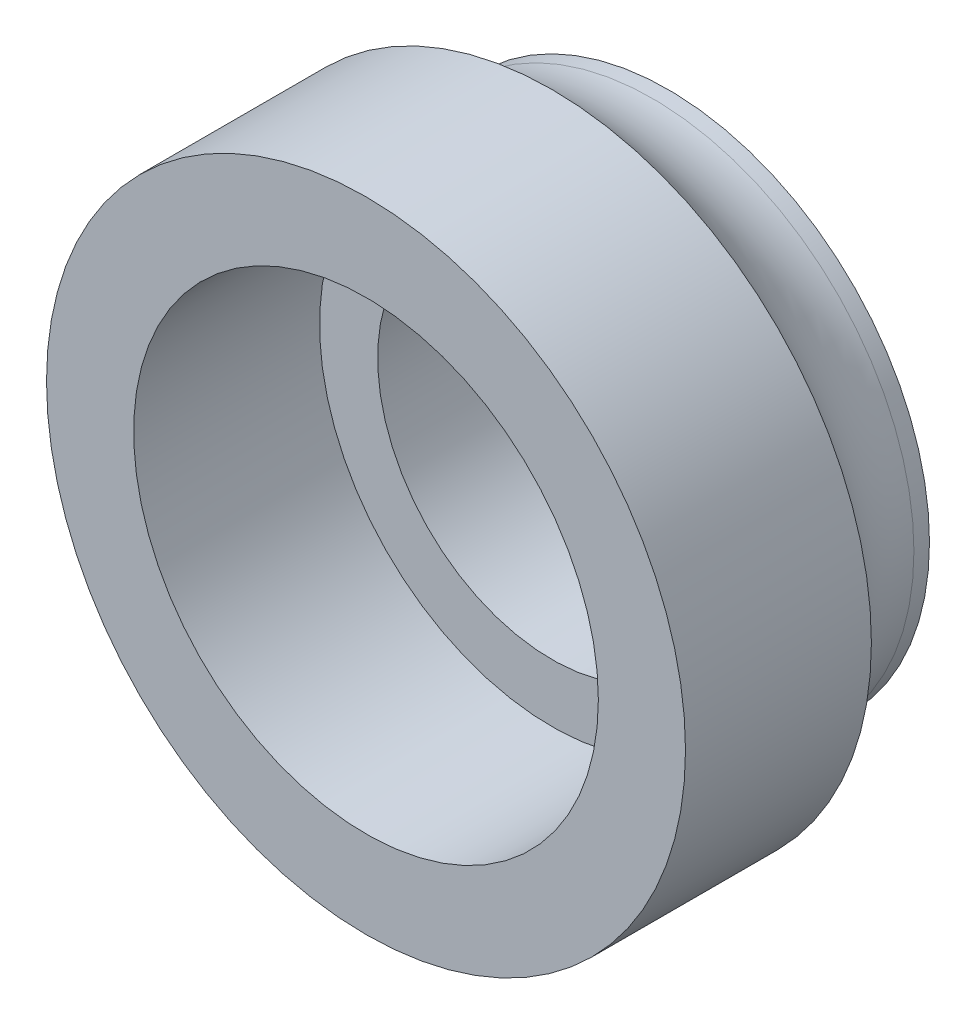
ISO-10303-21;
HEADER;
FILE_DESCRIPTION(('STEP AP214'),'2;1');
FILE_NAME('part.step','',(''),(''),'','','');
FILE_SCHEMA(('AUTOMOTIVE_DESIGN { 1 0 10303 214 1 1 1 1 }'));
ENDSEC;
DATA;
#1=APPLICATION_CONTEXT('core data for automotive mechanical design processes');
#2=APPLICATION_PROTOCOL_DEFINITION('international standard','automotive_design',2000,#1);
#3=PRODUCT_CONTEXT('',#1,'mechanical');
#4=PRODUCT('Part','Part','',(#3));
#5=PRODUCT_RELATED_PRODUCT_CATEGORY('part','',(#4));
#6=PRODUCT_DEFINITION_FORMATION('','',#4);
#7=PRODUCT_DEFINITION_CONTEXT('part definition',#1,'design');
#8=PRODUCT_DEFINITION('design','',#6,#7);
#9=PRODUCT_DEFINITION_SHAPE('','',#8);
#10=(LENGTH_UNIT() NAMED_UNIT(*) SI_UNIT(.MILLI.,.METRE.));
#11=(NAMED_UNIT(*) PLANE_ANGLE_UNIT() SI_UNIT($,.RADIAN.));
#12=(NAMED_UNIT(*) SI_UNIT($,.STERADIAN.) SOLID_ANGLE_UNIT());
#13=UNCERTAINTY_MEASURE_WITH_UNIT(LENGTH_MEASURE(1.E-05),#10,'distance_accuracy_value','');
#14=(GEOMETRIC_REPRESENTATION_CONTEXT(3) GLOBAL_UNCERTAINTY_ASSIGNED_CONTEXT((#13)) GLOBAL_UNIT_ASSIGNED_CONTEXT((#10,
#11,#12)) REPRESENTATION_CONTEXT('',''));
#15=CARTESIAN_POINT('',(0.,0.,0.));
#16=DIRECTION('',(0.,0.,1.));
#17=DIRECTION('',(1.,0.,0.));
#18=AXIS2_PLACEMENT_3D('',#15,#16,#17);
#19=CARTESIAN_POINT('',(0.,0.,2.));
#20=DIRECTION('',(0.,0.,1.));
#21=DIRECTION('',(1.,0.,0.));
#22=AXIS2_PLACEMENT_3D('',#19,#20,#21);
#23=PLANE('',#22);
#24=CARTESIAN_POINT('',(0.,0.,2.));
#25=DIRECTION('',(0.,0.,1.));
#26=DIRECTION('',(1.,0.,0.));
#27=AXIS2_PLACEMENT_3D('',#24,#25,#26);
#28=CIRCLE('',#27,3.);
#29=CARTESIAN_POINT('',(3.,0.,2.));
#30=VERTEX_POINT('',#29);
#31=EDGE_CURVE('E55',#30,#30,#28,.T.);
#32=ORIENTED_EDGE('',*,*,#31,.F.);
#33=EDGE_LOOP('',(#32));
#34=FACE_BOUND('',#33,.T.);
#35=CARTESIAN_POINT('',(0.,0.,2.));
#36=DIRECTION('',(0.,0.,1.));
#37=DIRECTION('',(1.,0.,0.));
#38=AXIS2_PLACEMENT_3D('',#35,#36,#37);
#39=CIRCLE('',#38,4.);
#40=CARTESIAN_POINT('',(4.,0.,2.));
#41=VERTEX_POINT('',#40);
#42=EDGE_CURVE('E42',#41,#41,#39,.F.);
#43=ORIENTED_EDGE('',*,*,#42,.F.);
#44=EDGE_LOOP('',(#43));
#45=FACE_BOUND('',#44,.T.);
#46=ADVANCED_FACE('F40',(#34,#45),#23,.T.);
#47=CARTESIAN_POINT('',(0.,0.,0.));
#48=DIRECTION('',(0.,0.,1.));
#49=DIRECTION('',(1.,0.,0.));
#50=AXIS2_PLACEMENT_3D('',#47,#48,#49);
#51=PLANE('',#50);
#52=CARTESIAN_POINT('',(0.,0.,0.));
#53=DIRECTION('',(0.,0.,1.));
#54=DIRECTION('',(1.,0.,0.));
#55=AXIS2_PLACEMENT_3D('',#52,#53,#54);
#56=CIRCLE('',#55,4.5);
#57=CARTESIAN_POINT('',(4.5,0.,0.));
#58=VERTEX_POINT('',#57);
#59=EDGE_CURVE('E48',#58,#58,#56,.T.);
#60=ORIENTED_EDGE('',*,*,#59,.F.);
#61=EDGE_LOOP('',(#60));
#62=FACE_BOUND('',#61,.T.);
#63=CARTESIAN_POINT('',(0.,0.,0.));
#64=DIRECTION('',(0.,0.,1.));
#65=DIRECTION('',(1.,0.,0.));
#66=AXIS2_PLACEMENT_3D('',#63,#64,#65);
#67=CIRCLE('',#66,3.);
#68=CARTESIAN_POINT('',(3.,0.,0.));
#69=VERTEX_POINT('',#68);
#70=EDGE_CURVE('E54',#69,#69,#67,.T.);
#71=ORIENTED_EDGE('',*,*,#70,.T.);
#72=EDGE_LOOP('',(#71));
#73=FACE_BOUND('',#72,.T.);
#74=ADVANCED_FACE('F90',(#62,#73),#51,.F.);
#75=CARTESIAN_POINT('',(0.,0.,2.));
#76=DIRECTION('',(0.,0.,-1.));
#77=DIRECTION('',(-1.,0.,0.));
#78=AXIS2_PLACEMENT_3D('',#75,#76,#77);
#79=CYLINDRICAL_SURFACE('',#78,4.5);
#80=CARTESIAN_POINT('',(0.,0.,0.267949192431123));
#81=DIRECTION('',(0.,0.,1.));
#82=DIRECTION('',(1.,0.,0.));
#83=AXIS2_PLACEMENT_3D('',#80,#81,#82);
#84=CIRCLE('',#83,4.5);
#85=CARTESIAN_POINT('',(4.5,0.,0.267949192431123));
#86=VERTEX_POINT('',#85);
#87=EDGE_CURVE('E10',#86,#86,#84,.F.);
#88=ORIENTED_EDGE('',*,*,#87,.T.);
#89=EDGE_LOOP('',(#88));
#90=FACE_BOUND('',#89,.T.);
#91=ORIENTED_EDGE('',*,*,#59,.T.);
#92=EDGE_LOOP('',(#91));
#93=FACE_BOUND('',#92,.T.);
#94=ADVANCED_FACE('F82',(#90,#93),#79,.T.);
#95=CARTESIAN_POINT('',(0.,0.,2.));
#96=DIRECTION('',(0.,0.,-1.));
#97=DIRECTION('',(-1.,0.,0.));
#98=AXIS2_PLACEMENT_3D('',#95,#96,#97);
#99=CYLINDRICAL_SURFACE('',#98,3.);
#100=ORIENTED_EDGE('',*,*,#31,.T.);
#101=EDGE_LOOP('',(#100));
#102=FACE_BOUND('',#101,.T.);
#103=ORIENTED_EDGE('',*,*,#70,.F.);
#104=EDGE_LOOP('',(#103));
#105=FACE_BOUND('',#104,.T.);
#106=ADVANCED_FACE('F73',(#102,#105),#99,.F.);
#107=CARTESIAN_POINT('',(0.,0.,5.2));
#108=DIRECTION('',(0.,0.,1.));
#109=DIRECTION('',(1.,0.,0.));
#110=AXIS2_PLACEMENT_3D('',#107,#108,#109);
#111=PLANE('',#110);
#112=CARTESIAN_POINT('',(0.,0.,5.2));
#113=DIRECTION('',(0.,0.,1.));
#114=DIRECTION('',(1.,0.,0.));
#115=AXIS2_PLACEMENT_3D('',#112,#113,#114);
#116=CIRCLE('',#115,5.5);
#117=CARTESIAN_POINT('',(5.5,0.,5.2));
#118=VERTEX_POINT('',#117);
#119=EDGE_CURVE('E59',#118,#118,#116,.T.);
#120=ORIENTED_EDGE('',*,*,#119,.T.);
#121=EDGE_LOOP('',(#120));
#122=FACE_BOUND('',#121,.T.);
#123=CARTESIAN_POINT('',(0.,0.,5.2));
#124=DIRECTION('',(0.,0.,1.));
#125=DIRECTION('',(1.,0.,0.));
#126=AXIS2_PLACEMENT_3D('',#123,#124,#125);
#127=CIRCLE('',#126,4.);
#128=CARTESIAN_POINT('',(4.,0.,5.2));
#129=VERTEX_POINT('',#128);
#130=EDGE_CURVE('E64',#129,#129,#127,.T.);
#131=ORIENTED_EDGE('',*,*,#130,.F.);
#132=EDGE_LOOP('',(#131));
#133=FACE_BOUND('',#132,.T.);
#134=ADVANCED_FACE('F75',(#122,#133),#111,.T.);
#135=CARTESIAN_POINT('',(0.,0.,5.2));
#136=DIRECTION('',(0.,0.,-1.));
#137=DIRECTION('',(-1.,0.,0.));
#138=AXIS2_PLACEMENT_3D('',#135,#136,#137);
#139=CYLINDRICAL_SURFACE('',#138,5.5);
#140=ORIENTED_EDGE('',*,*,#119,.F.);
#141=EDGE_LOOP('',(#140));
#142=FACE_BOUND('',#141,.T.);
#143=CARTESIAN_POINT('',(0.,0.,2.));
#144=DIRECTION('',(0.,0.,1.));
#145=DIRECTION('',(1.,0.,0.));
#146=AXIS2_PLACEMENT_3D('',#143,#144,#145);
#147=CIRCLE('',#146,5.5);
#148=CARTESIAN_POINT('',(5.5,0.,2.));
#149=VERTEX_POINT('',#148);
#150=EDGE_CURVE('E63',#149,#149,#147,.T.);
#151=ORIENTED_EDGE('',*,*,#150,.T.);
#152=EDGE_LOOP('',(#151));
#153=FACE_BOUND('',#152,.T.);
#154=ADVANCED_FACE('F74',(#142,#153),#139,.T.);
#155=CARTESIAN_POINT('',(0.,0.,5.2));
#156=DIRECTION('',(0.,0.,-1.));
#157=DIRECTION('',(-1.,0.,0.));
#158=AXIS2_PLACEMENT_3D('',#155,#156,#157);
#159=CYLINDRICAL_SURFACE('',#158,4.);
#160=ORIENTED_EDGE('',*,*,#130,.T.);
#161=EDGE_LOOP('',(#160));
#162=FACE_BOUND('',#161,.T.);
#163=ORIENTED_EDGE('',*,*,#42,.T.);
#164=EDGE_LOOP('',(#163));
#165=FACE_BOUND('',#164,.T.);
#166=ADVANCED_FACE('F67',(#162,#165),#159,.F.);
#167=CARTESIAN_POINT('',(0.,0.,0.267949192431123));
#168=DIRECTION('',(0.,0.,1.));
#169=DIRECTION('',(1.,0.,0.));
#170=AXIS2_PLACEMENT_3D('',#167,#168,#169);
#171=TOROIDAL_SURFACE('',#170,6.5,2.);
#172=ORIENTED_EDGE('',*,*,#87,.F.);
#173=EDGE_LOOP('',(#172));
#174=FACE_BOUND('',#173,.T.);
#175=ORIENTED_EDGE('',*,*,#150,.F.);
#176=EDGE_LOOP('',(#175));
#177=FACE_BOUND('',#176,.T.);
#178=ADVANCED_FACE('F39',(#174,#177),#171,.F.);
#179=CLOSED_SHELL('',(#46,#74,#94,#106,#134,#154,#166,#178));
#180=MANIFOLD_SOLID_BREP('B2',#179);
#181=ADVANCED_BREP_SHAPE_REPRESENTATION('',(#18,#180),#14);
#182=SHAPE_DEFINITION_REPRESENTATION(#9,#181);
ENDSEC;
END-ISO-10303-21;
